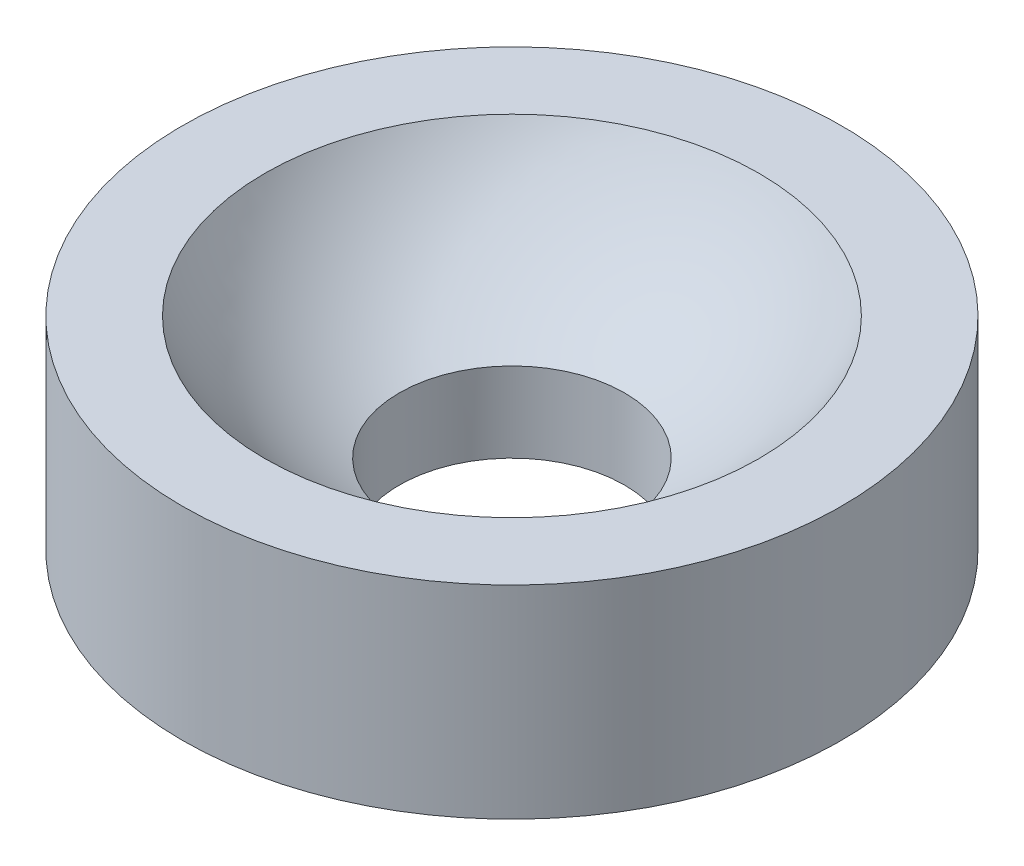
ISO-10303-21;
HEADER;
FILE_DESCRIPTION(('STEP AP214'),'2;1');
FILE_NAME('part.step','',(''),(''),'','','');
FILE_SCHEMA(('AUTOMOTIVE_DESIGN { 1 0 10303 214 1 1 1 1 }'));
ENDSEC;
DATA;
#1=APPLICATION_CONTEXT('core data for automotive mechanical design processes');
#2=APPLICATION_PROTOCOL_DEFINITION('international standard','automotive_design',2000,#1);
#3=PRODUCT_CONTEXT('',#1,'mechanical');
#4=PRODUCT('Part','Part','',(#3));
#5=PRODUCT_RELATED_PRODUCT_CATEGORY('part','',(#4));
#6=PRODUCT_DEFINITION_FORMATION('','',#4);
#7=PRODUCT_DEFINITION_CONTEXT('part definition',#1,'design');
#8=PRODUCT_DEFINITION('design','',#6,#7);
#9=PRODUCT_DEFINITION_SHAPE('','',#8);
#10=(LENGTH_UNIT() NAMED_UNIT(*) SI_UNIT(.MILLI.,.METRE.));
#11=(NAMED_UNIT(*) PLANE_ANGLE_UNIT() SI_UNIT($,.RADIAN.));
#12=(NAMED_UNIT(*) SI_UNIT($,.STERADIAN.) SOLID_ANGLE_UNIT());
#13=UNCERTAINTY_MEASURE_WITH_UNIT(LENGTH_MEASURE(1.E-05),#10,'distance_accuracy_value','');
#14=(GEOMETRIC_REPRESENTATION_CONTEXT(3) GLOBAL_UNCERTAINTY_ASSIGNED_CONTEXT((#13)) GLOBAL_UNIT_ASSIGNED_CONTEXT((#10,
#11,#12)) REPRESENTATION_CONTEXT('',''));
#15=CARTESIAN_POINT('',(0.,0.,0.));
#16=DIRECTION('',(0.,0.,1.));
#17=DIRECTION('',(1.,0.,0.));
#18=AXIS2_PLACEMENT_3D('',#15,#16,#17);
#19=CARTESIAN_POINT('',(0.,3.6,0.));
#20=DIRECTION('',(0.,-1.,0.));
#21=DIRECTION('',(0.,0.,-1.));
#22=AXIS2_PLACEMENT_3D('',#19,#20,#21);
#23=CYLINDRICAL_SURFACE('',#22,5.85);
#24=CARTESIAN_POINT('',(0.,3.6,0.));
#25=DIRECTION('',(0.,1.,0.));
#26=DIRECTION('',(0.,0.,1.));
#27=AXIS2_PLACEMENT_3D('',#24,#25,#26);
#28=CIRCLE('',#27,5.85);
#29=CARTESIAN_POINT('',(0.,3.6,5.85));
#30=VERTEX_POINT('',#29);
#31=EDGE_CURVE('E10',#30,#30,#28,.T.);
#32=ORIENTED_EDGE('',*,*,#31,.F.);
#33=EDGE_LOOP('',(#32));
#34=FACE_BOUND('',#33,.T.);
#35=CARTESIAN_POINT('',(0.,0.,0.));
#36=DIRECTION('',(0.,1.,0.));
#37=DIRECTION('',(0.,0.,1.));
#38=AXIS2_PLACEMENT_3D('',#35,#36,#37);
#39=CIRCLE('',#38,5.85);
#40=CARTESIAN_POINT('',(0.,0.,5.85));
#41=VERTEX_POINT('',#40);
#42=EDGE_CURVE('E40',#41,#41,#39,.T.);
#43=ORIENTED_EDGE('',*,*,#42,.T.);
#44=EDGE_LOOP('',(#43));
#45=FACE_BOUND('',#44,.T.);
#46=ADVANCED_FACE('F33',(#34,#45),#23,.T.);
#47=CARTESIAN_POINT('',(0.,3.6,0.));
#48=DIRECTION('',(0.,1.,0.));
#49=DIRECTION('',(0.,0.,1.));
#50=AXIS2_PLACEMENT_3D('',#47,#48,#49);
#51=PLANE('',#50);
#52=CARTESIAN_POINT('',(0.,3.6,0.));
#53=DIRECTION('',(0.,1.,0.));
#54=DIRECTION('',(0.,0.,1.));
#55=AXIS2_PLACEMENT_3D('',#52,#53,#54);
#56=CIRCLE('',#55,4.38634243989226);
#57=CARTESIAN_POINT('',(-4.38634243989226,3.6,0.));
#58=VERTEX_POINT('',#57);
#59=EDGE_CURVE('E45',#58,#58,#56,.T.);
#60=ORIENTED_EDGE('',*,*,#59,.F.);
#61=EDGE_LOOP('',(#60));
#62=FACE_BOUND('',#61,.T.);
#63=ORIENTED_EDGE('',*,*,#31,.T.);
#64=EDGE_LOOP('',(#63));
#65=FACE_BOUND('',#64,.T.);
#66=ADVANCED_FACE('F65',(#62,#65),#51,.T.);
#67=CARTESIAN_POINT('',(0.,0.,0.));
#68=DIRECTION('',(0.,1.,0.));
#69=DIRECTION('',(0.,0.,1.));
#70=AXIS2_PLACEMENT_3D('',#67,#68,#69);
#71=PLANE('',#70);
#72=CARTESIAN_POINT('',(0.,0.,0.));
#73=DIRECTION('',(0.,-1.,0.));
#74=DIRECTION('',(0.,0.,-1.));
#75=AXIS2_PLACEMENT_3D('',#72,#73,#74);
#76=CIRCLE('',#75,2.);
#77=CARTESIAN_POINT('',(0.,0.,-2.));
#78=VERTEX_POINT('',#77);
#79=EDGE_CURVE('E48',#78,#78,#76,.T.);
#80=ORIENTED_EDGE('',*,*,#79,.F.);
#81=EDGE_LOOP('',(#80));
#82=FACE_BOUND('',#81,.T.);
#83=ORIENTED_EDGE('',*,*,#42,.F.);
#84=EDGE_LOOP('',(#83));
#85=FACE_BOUND('',#84,.T.);
#86=ADVANCED_FACE('F61',(#82,#85),#71,.F.);
#87=CARTESIAN_POINT('',(0.,6.,0.));
#88=DIRECTION('',(0.,-1.,0.));
#89=DIRECTION('',(-1.,0.,0.));
#90=AXIS2_PLACEMENT_3D('',#87,#88,#89);
#91=SPHERICAL_SURFACE('',#90,5.);
#92=CARTESIAN_POINT('',(0.,1.41742430504416,0.));
#93=DIRECTION('',(0.,1.,0.));
#94=DIRECTION('',(0.,0.,1.));
#95=AXIS2_PLACEMENT_3D('',#92,#93,#94);
#96=CIRCLE('',#95,2.);
#97=CARTESIAN_POINT('',(-2.,1.41742430504416,0.));
#98=VERTEX_POINT('',#97);
#99=EDGE_CURVE('E36',#98,#98,#96,.F.);
#100=CARTESIAN_POINT('',(-2.,1.41742430504416,0.));
#101=CARTESIAN_POINT('',(-2.03143958345257,1.43114560560253,0.));
#102=CARTESIAN_POINT('',(-2.06273791639557,1.44519054695102,0.));
#103=CARTESIAN_POINT('',(-2.12503892191581,1.47392154753541,0.));
#104=CARTESIAN_POINT('',(-2.15604159449305,1.48860760677131,0.));
#105=CARTESIAN_POINT('',(-2.21773811993518,1.51861467943769,0.));
#106=CARTESIAN_POINT('',(-2.24843197280006,1.53393569286816,0.));
#107=CARTESIAN_POINT('',(-2.30949786384715,1.56520616849143,0.));
#108=CARTESIAN_POINT('',(-2.33986990202936,1.58115563068422,0.));
#109=CARTESIAN_POINT('',(-2.40027929607097,1.61367625168459,0.));
#110=CARTESIAN_POINT('',(-2.43031665193038,1.63024741049216,0.));
#111=CARTESIAN_POINT('',(-2.4900439578687,1.66400440399629,0.));
#112=CARTESIAN_POINT('',(-2.51973390794761,1.68119023869283,0.));
#113=CARTESIAN_POINT('',(-2.57875382538438,1.71616930426939,0.));
#114=CARTESIAN_POINT('',(-2.60808379274224,1.73396253514939,0.));
#115=CARTESIAN_POINT('',(-2.66637132045975,1.77014885571634,0.));
#116=CARTESIAN_POINT('',(-2.69532888081939,1.78854194540328,0.));
#117=CARTESIAN_POINT('',(-2.75285932797031,1.82592019220502,0.));
#118=CARTESIAN_POINT('',(-2.78143221476158,1.84490534931982,0.));
#119=CARTESIAN_POINT('',(-2.8381812111676,1.8834596887687,0.));
#120=CARTESIAN_POINT('',(-2.86635732078234,1.90302887110278,0.));
#121=CARTESIAN_POINT('',(-2.92230082730048,1.94274297139301,0.));
#122=CARTESIAN_POINT('',(-2.95006822420388,1.96288788934916,0.));
#123=CARTESIAN_POINT('',(-3.00518254289808,2.0037449274,0.));
#124=CARTESIAN_POINT('',(-3.03252946468888,2.0244570474947,0.));
#125=CARTESIAN_POINT('',(-3.08679124887164,2.06643971607014,0.));
#126=CARTESIAN_POINT('',(-3.11370611126361,2.08771026455088,0.));
#127=CARTESIAN_POINT('',(-3.16709237538494,2.13080077959283,0.));
#128=CARTESIAN_POINT('',(-3.1935637771143,2.15262074615404,0.));
#129=CARTESIAN_POINT('',(-3.2460519064987,2.19680085431528,0.));
#130=CARTESIAN_POINT('',(-3.27206863415374,2.21916099591531,0.));
#131=CARTESIAN_POINT('',(-3.32363639457987,2.26441198229181,0.));
#132=CARTESIAN_POINT('',(-3.34918742735095,2.28730282706829,0.));
#133=CARTESIAN_POINT('',(-3.39981297447012,2.33360552312691,0.));
#134=CARTESIAN_POINT('',(-3.4248874888182,2.35701737440907,0.));
#135=CARTESIAN_POINT('',(-3.47454937740777,2.40435216610746,0.));
#136=CARTESIAN_POINT('',(-3.49913675164926,2.42827510652369,0.));
#137=CARTESIAN_POINT('',(-3.54781394469692,2.47662194261886,0.));
#138=CARTESIAN_POINT('',(-3.5719037635031,2.50104583829779,0.));
#139=CARTESIAN_POINT('',(-3.61957564111828,2.55038423883992,0.));
#140=CARTESIAN_POINT('',(-3.64315769992729,2.57529874370312,0.));
#141=CARTESIAN_POINT('',(-3.68980406807578,2.625607808711,0.));
#142=CARTESIAN_POINT('',(-3.71286837741527,2.65100236885568,0.));
#143=CARTESIAN_POINT('',(-3.75846947647366,2.70226078716996,0.));
#144=CARTESIAN_POINT('',(-3.78100626619256,2.72812464533955,0.));
#145=CARTESIAN_POINT('',(-3.82554277931802,2.78031070365049,0.));
#146=CARTESIAN_POINT('',(-3.84754250272458,2.80663290379184,0.));
#147=CARTESIAN_POINT('',(-3.89099556403931,2.85972449583623,0.));
#148=CARTESIAN_POINT('',(-3.91244890194748,2.88649388773927,0.));
#149=CARTESIAN_POINT('',(-3.95480010452398,2.94046852366839,0.));
#150=CARTESIAN_POINT('',(-3.9756979691923,2.96767376769447,0.));
#151=CARTESIAN_POINT('',(-4.01692937287449,3.0225085835872,0.));
#152=CARTESIAN_POINT('',(-4.03726291188835,3.05013815545385,0.));
#153=CARTESIAN_POINT('',(-4.07735705080202,3.10580992305308,0.));
#154=CARTESIAN_POINT('',(-4.09711765070184,3.13385211878567,0.));
#155=CARTESIAN_POINT('',(-4.13605754098582,3.190337255147,0.));
#156=CARTESIAN_POINT('',(-4.15523683136997,3.21878019577575,0.));
#157=CARTESIAN_POINT('',(-4.19300597712957,3.27605477396988,0.));
#158=CARTESIAN_POINT('',(-4.21159583250502,3.30488641153525,0.));
#159=CARTESIAN_POINT('',(-4.24817823743103,3.36292616812424,0.));
#160=CARTESIAN_POINT('',(-4.2661707869816,3.39213428714786,0.));
#161=CARTESIAN_POINT('',(-4.30155094384255,3.45091464238777,0.));
#162=CARTESIAN_POINT('',(-4.31893855115294,3.48048687860406,0.));
#163=CARTESIAN_POINT('',(-4.35310151286814,3.53998290981842,0.));
#164=CARTESIAN_POINT('',(-4.36987686727294,3.56990670481648,0.));
#165=CARTESIAN_POINT('',(-4.38634243989226,3.6,0.));
#166=B_SPLINE_CURVE_WITH_KNOTS('',3,(#100,#101,#102,#103,#104,#105,#106,#107,#108,#109,#110,
#111,#112,#113,#114,#115,#116,#117,#118,#119,#120,#121,#122,#123,#124,#125,#126,#127,#128,#129,
#130,#131,#132,#133,#134,#135,#136,#137,#138,#139,#140,#141,#142,#143,#144,#145,#146,#147,#148,
#149,#150,#151,#152,#153,#154,#155,#156,#157,#158,#159,#160,#161,#162,#163,#164,#165),
.UNSPECIFIED.,.F.,.F.,(4,2,2,2,2,2,2,2,2,2,2,2,2,2,2,2,2,2,2,2,2,2,2,2,2,2,2,2,2,2,2,2,4),(0.,
0.102908303611915,0.205816607223831,0.308724910835745,0.411633214447661,0.514541518059576,
0.617449821671491,0.720358125283406,0.823266428895322,0.926174732507236,1.02908303611915,
1.13199133973107,1.23489964334298,1.3378079469549,1.44071625056681,1.54362455417873,
1.64653285779064,1.74944116140256,1.85234946501447,1.95525776862639,2.0581660722383,
2.16107437585022,2.26398267946213,2.36689098307405,2.46979928668596,2.57270759029788,
2.67561589390979,2.77852419752171,2.88143250113362,2.98434080474554,3.08724910835746,
3.19015741196937,3.29306571558128),.UNSPECIFIED.);
#167=EDGE_CURVE('BSEAM64',#98,#58,#166,.T.);
#168=ORIENTED_EDGE('',*,*,#99,.T.);
#169=ORIENTED_EDGE('',*,*,#59,.T.);
#170=ORIENTED_EDGE('',*,*,#167,.T.);
#171=ORIENTED_EDGE('',*,*,#167,.F.);
#172=EDGE_LOOP('',(#168,#170,#169,#171));
#173=FACE_BOUND('',#172,.T.);
#174=ADVANCED_FACE('F64',(#173),#91,.F.);
#175=CARTESIAN_POINT('',(0.,4.,0.));
#176=DIRECTION('',(0.,-1.,0.));
#177=DIRECTION('',(0.,0.,-1.));
#178=AXIS2_PLACEMENT_3D('',#175,#176,#177);
#179=CYLINDRICAL_SURFACE('',#178,2.);
#180=ORIENTED_EDGE('',*,*,#79,.T.);
#181=EDGE_LOOP('',(#180));
#182=FACE_BOUND('',#181,.T.);
#183=ORIENTED_EDGE('',*,*,#99,.F.);
#184=EDGE_LOOP('',(#183));
#185=FACE_BOUND('',#184,.T.);
#186=ADVANCED_FACE('F58',(#182,#185),#179,.F.);
#187=CLOSED_SHELL('',(#46,#66,#86,#174,#186));
#188=MANIFOLD_SOLID_BREP('B2',#187);
#189=ADVANCED_BREP_SHAPE_REPRESENTATION('',(#18,#188),#14);
#190=SHAPE_DEFINITION_REPRESENTATION(#9,#189);
ENDSEC;
END-ISO-10303-21;
